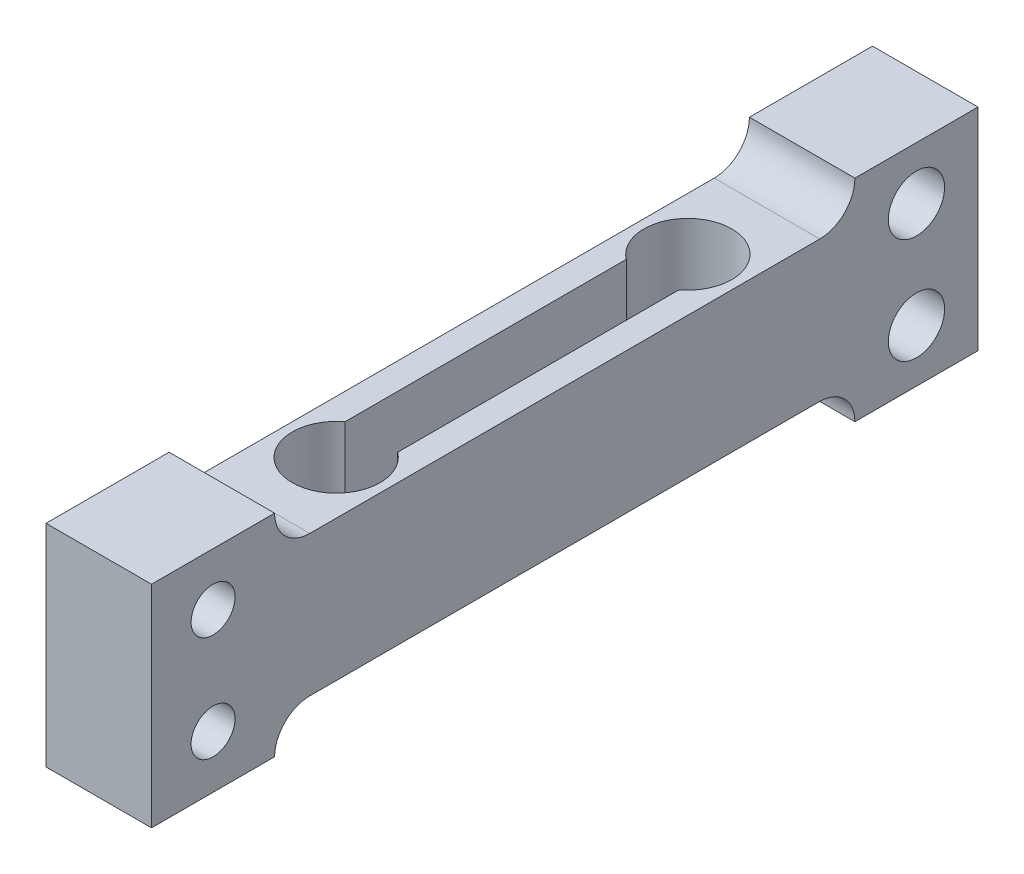
ISO-10303-21;
HEADER;
FILE_DESCRIPTION(('STEP AP214'),'2;1');
FILE_NAME('part.step','',(''),(''),'','','');
FILE_SCHEMA(('AUTOMOTIVE_DESIGN { 1 0 10303 214 1 1 1 1 }'));
ENDSEC;
DATA;
#1=APPLICATION_CONTEXT('core data for automotive mechanical design processes');
#2=APPLICATION_PROTOCOL_DEFINITION('international standard','automotive_design',2000,#1);
#3=PRODUCT_CONTEXT('',#1,'mechanical');
#4=PRODUCT('Part','Part','',(#3));
#5=PRODUCT_RELATED_PRODUCT_CATEGORY('part','',(#4));
#6=PRODUCT_DEFINITION_FORMATION('','',#4);
#7=PRODUCT_DEFINITION_CONTEXT('part definition',#1,'design');
#8=PRODUCT_DEFINITION('design','',#6,#7);
#9=PRODUCT_DEFINITION_SHAPE('','',#8);
#10=(LENGTH_UNIT() NAMED_UNIT(*) SI_UNIT(.MILLI.,.METRE.));
#11=(NAMED_UNIT(*) PLANE_ANGLE_UNIT() SI_UNIT($,.RADIAN.));
#12=(NAMED_UNIT(*) SI_UNIT($,.STERADIAN.) SOLID_ANGLE_UNIT());
#13=UNCERTAINTY_MEASURE_WITH_UNIT(LENGTH_MEASURE(1.E-05),#10,'distance_accuracy_value','');
#14=(GEOMETRIC_REPRESENTATION_CONTEXT(3) GLOBAL_UNCERTAINTY_ASSIGNED_CONTEXT((#13)) GLOBAL_UNIT_ASSIGNED_CONTEXT((#10,
#11,#12)) REPRESENTATION_CONTEXT('',''));
#15=CARTESIAN_POINT('',(0.,0.,0.));
#16=DIRECTION('',(0.,0.,1.));
#17=DIRECTION('',(1.,0.,0.));
#18=AXIS2_PLACEMENT_3D('',#15,#16,#17);
#19=CARTESIAN_POINT('',(6.,6.,23.5));
#20=DIRECTION('',(0.,-1.,0.));
#21=DIRECTION('',(0.,0.,-1.));
#22=AXIS2_PLACEMENT_3D('',#19,#20,#21);
#23=PLANE('',#22);
#24=DIRECTION('',(0.,0.,1.));
#25=VECTOR('',#24,1.);
#26=CARTESIAN_POINT('',(6.,6.,23.5));
#27=LINE('',#26,#25);
#28=CARTESIAN_POINT('',(6.,6.,16.5));
#29=VERTEX_POINT('',#28);
#30=CARTESIAN_POINT('',(6.,6.,23.5));
#31=VERTEX_POINT('',#30);
#32=EDGE_CURVE('E264',#29,#31,#27,.T.);
#33=ORIENTED_EDGE('',*,*,#32,.F.);
#34=DIRECTION('',(1.,0.,0.));
#35=VECTOR('',#34,1.);
#36=CARTESIAN_POINT('',(0.,6.,16.5));
#37=LINE('',#36,#35);
#38=CARTESIAN_POINT('',(0.,6.,16.5));
#39=VERTEX_POINT('',#38);
#40=EDGE_CURVE('E228',#39,#29,#37,.T.);
#41=ORIENTED_EDGE('',*,*,#40,.F.);
#42=DIRECTION('',(0.,0.,1.));
#43=VECTOR('',#42,1.);
#44=CARTESIAN_POINT('',(0.,6.,23.5));
#45=LINE('',#44,#43);
#46=CARTESIAN_POINT('',(0.,6.,23.5));
#47=VERTEX_POINT('',#46);
#48=EDGE_CURVE('E278',#39,#47,#45,.T.);
#49=ORIENTED_EDGE('',*,*,#48,.T.);
#50=DIRECTION('',(-1.,0.,0.));
#51=VECTOR('',#50,1.);
#52=CARTESIAN_POINT('',(6.,6.,23.5));
#53=LINE('',#52,#51);
#54=EDGE_CURVE('E292',#31,#47,#53,.T.);
#55=ORIENTED_EDGE('',*,*,#54,.F.);
#56=EDGE_LOOP('',(#33,#41,#49,#55));
#57=FACE_BOUND('',#56,.T.);
#58=ADVANCED_FACE('F45',(#57),#23,.F.);
#59=CARTESIAN_POINT('',(6.,-6.,23.5));
#60=DIRECTION('',(0.,1.,0.));
#61=DIRECTION('',(0.,0.,1.));
#62=AXIS2_PLACEMENT_3D('',#59,#60,#61);
#63=PLANE('',#62);
#64=DIRECTION('',(0.,0.,-1.));
#65=VECTOR('',#64,1.);
#66=CARTESIAN_POINT('',(6.,-6.,23.5));
#67=LINE('',#66,#65);
#68=CARTESIAN_POINT('',(6.,-6.,-16.5));
#69=VERTEX_POINT('',#68);
#70=CARTESIAN_POINT('',(6.,-6.,-23.5));
#71=VERTEX_POINT('',#70);
#72=EDGE_CURVE('E271',#69,#71,#67,.T.);
#73=ORIENTED_EDGE('',*,*,#72,.F.);
#74=DIRECTION('',(1.,0.,0.));
#75=VECTOR('',#74,1.);
#76=CARTESIAN_POINT('',(0.,-6.,-16.5));
#77=LINE('',#76,#75);
#78=CARTESIAN_POINT('',(0.,-6.,-16.5));
#79=VERTEX_POINT('',#78);
#80=EDGE_CURVE('E224',#79,#69,#77,.T.);
#81=ORIENTED_EDGE('',*,*,#80,.F.);
#82=DIRECTION('',(0.,0.,-1.));
#83=VECTOR('',#82,1.);
#84=CARTESIAN_POINT('',(0.,-6.,23.5));
#85=LINE('',#84,#83);
#86=CARTESIAN_POINT('',(0.,-6.,-23.5));
#87=VERTEX_POINT('',#86);
#88=EDGE_CURVE('E284',#79,#87,#85,.T.);
#89=ORIENTED_EDGE('',*,*,#88,.T.);
#90=DIRECTION('',(-1.,0.,0.));
#91=VECTOR('',#90,1.);
#92=CARTESIAN_POINT('',(6.,-6.,-23.5));
#93=LINE('',#92,#91);
#94=EDGE_CURVE('E275',#71,#87,#93,.T.);
#95=ORIENTED_EDGE('',*,*,#94,.F.);
#96=EDGE_LOOP('',(#73,#81,#89,#95));
#97=FACE_BOUND('',#96,.T.);
#98=ADVANCED_FACE('F324',(#97),#63,.F.);
#99=CARTESIAN_POINT('',(6.,-6.,-23.5));
#100=DIRECTION('',(0.,0.,1.));
#101=DIRECTION('',(1.,0.,0.));
#102=AXIS2_PLACEMENT_3D('',#99,#100,#101);
#103=PLANE('',#102);
#104=DIRECTION('',(0.,1.,0.));
#105=VECTOR('',#104,1.);
#106=CARTESIAN_POINT('',(0.,-6.,-23.5));
#107=LINE('',#106,#105);
#108=CARTESIAN_POINT('',(0.,6.,-23.5));
#109=VERTEX_POINT('',#108);
#110=EDGE_CURVE('E230',#87,#109,#107,.T.);
#111=ORIENTED_EDGE('',*,*,#110,.T.);
#112=DIRECTION('',(-1.,0.,0.));
#113=VECTOR('',#112,1.);
#114=CARTESIAN_POINT('',(6.,6.,-23.5));
#115=LINE('',#114,#113);
#116=CARTESIAN_POINT('',(6.,6.,-23.5));
#117=VERTEX_POINT('',#116);
#118=EDGE_CURVE('E295',#117,#109,#115,.T.);
#119=ORIENTED_EDGE('',*,*,#118,.F.);
#120=DIRECTION('',(0.,1.,0.));
#121=VECTOR('',#120,1.);
#122=CARTESIAN_POINT('',(6.,-6.,-23.5));
#123=LINE('',#122,#121);
#124=EDGE_CURVE('E261',#71,#117,#123,.T.);
#125=ORIENTED_EDGE('',*,*,#124,.F.);
#126=ORIENTED_EDGE('',*,*,#94,.T.);
#127=EDGE_LOOP('',(#111,#119,#125,#126));
#128=FACE_BOUND('',#127,.T.);
#129=ADVANCED_FACE('F47',(#128),#103,.F.);
#130=CARTESIAN_POINT('',(0.,6.,-16.5));
#131=VERTEX_POINT('',#130);
#132=EDGE_CURVE('E279',#109,#131,#45,.T.);
#133=ORIENTED_EDGE('',*,*,#132,.T.);
#134=DIRECTION('',(1.,0.,0.));
#135=VECTOR('',#134,1.);
#136=CARTESIAN_POINT('',(0.,6.,-16.5));
#137=LINE('',#136,#135);
#138=CARTESIAN_POINT('',(6.,6.,-16.5));
#139=VERTEX_POINT('',#138);
#140=EDGE_CURVE('E231',#131,#139,#137,.T.);
#141=ORIENTED_EDGE('',*,*,#140,.T.);
#142=EDGE_CURVE('E266',#117,#139,#27,.T.);
#143=ORIENTED_EDGE('',*,*,#142,.F.);
#144=ORIENTED_EDGE('',*,*,#118,.T.);
#145=EDGE_LOOP('',(#133,#141,#143,#144));
#146=FACE_BOUND('',#145,.T.);
#147=ADVANCED_FACE('F326',(#146),#23,.F.);
#148=CARTESIAN_POINT('',(6.,-6.,23.5));
#149=DIRECTION('',(0.,0.,-1.));
#150=DIRECTION('',(-1.,0.,0.));
#151=AXIS2_PLACEMENT_3D('',#148,#149,#150);
#152=PLANE('',#151);
#153=DIRECTION('',(0.,-1.,0.));
#154=VECTOR('',#153,1.);
#155=CARTESIAN_POINT('',(0.,-6.,23.5));
#156=LINE('',#155,#154);
#157=CARTESIAN_POINT('',(0.,-6.,23.5));
#158=VERTEX_POINT('',#157);
#159=EDGE_CURVE('E282',#47,#158,#156,.T.);
#160=ORIENTED_EDGE('',*,*,#159,.T.);
#161=DIRECTION('',(-1.,0.,0.));
#162=VECTOR('',#161,1.);
#163=CARTESIAN_POINT('',(6.,-6.,23.5));
#164=LINE('',#163,#162);
#165=CARTESIAN_POINT('',(6.,-6.,23.5));
#166=VERTEX_POINT('',#165);
#167=EDGE_CURVE('E289',#166,#158,#164,.T.);
#168=ORIENTED_EDGE('',*,*,#167,.F.);
#169=DIRECTION('',(0.,-1.,0.));
#170=VECTOR('',#169,1.);
#171=CARTESIAN_POINT('',(6.,-6.,23.5));
#172=LINE('',#171,#170);
#173=EDGE_CURVE('E269',#31,#166,#172,.T.);
#174=ORIENTED_EDGE('',*,*,#173,.F.);
#175=ORIENTED_EDGE('',*,*,#54,.T.);
#176=EDGE_LOOP('',(#160,#168,#174,#175));
#177=FACE_BOUND('',#176,.T.);
#178=ADVANCED_FACE('F337',(#177),#152,.F.);
#179=CARTESIAN_POINT('',(0.,-6.,16.5));
#180=VERTEX_POINT('',#179);
#181=EDGE_CURVE('E265',#158,#180,#85,.T.);
#182=ORIENTED_EDGE('',*,*,#181,.T.);
#183=DIRECTION('',(1.,0.,0.));
#184=VECTOR('',#183,1.);
#185=CARTESIAN_POINT('',(0.,-6.,16.5));
#186=LINE('',#185,#184);
#187=CARTESIAN_POINT('',(6.,-6.,16.5));
#188=VERTEX_POINT('',#187);
#189=EDGE_CURVE('E255',#180,#188,#186,.T.);
#190=ORIENTED_EDGE('',*,*,#189,.T.);
#191=EDGE_CURVE('E272',#166,#188,#67,.T.);
#192=ORIENTED_EDGE('',*,*,#191,.F.);
#193=ORIENTED_EDGE('',*,*,#167,.T.);
#194=EDGE_LOOP('',(#182,#190,#192,#193));
#195=FACE_BOUND('',#194,.T.);
#196=ADVANCED_FACE('F333',(#195),#63,.F.);
#197=CARTESIAN_POINT('',(6.,0.,0.));
#198=DIRECTION('',(-1.,0.,0.));
#199=DIRECTION('',(0.,0.,1.));
#200=AXIS2_PLACEMENT_3D('',#197,#198,#199);
#201=PLANE('',#200);
#202=CARTESIAN_POINT('',(6.,3.,20.));
#203=DIRECTION('',(1.,0.,0.));
#204=DIRECTION('',(0.,0.,-1.));
#205=AXIS2_PLACEMENT_3D('',#202,#203,#204);
#206=CIRCLE('',#205,1.25);
#207=CARTESIAN_POINT('',(6.,3.,18.75));
#208=VERTEX_POINT('',#207);
#209=EDGE_CURVE('E184',#208,#208,#206,.T.);
#210=ORIENTED_EDGE('',*,*,#209,.F.);
#211=EDGE_LOOP('',(#210));
#212=FACE_BOUND('',#211,.T.);
#213=CARTESIAN_POINT('',(6.,-3.,20.));
#214=DIRECTION('',(1.,0.,0.));
#215=DIRECTION('',(0.,0.,-1.));
#216=AXIS2_PLACEMENT_3D('',#213,#214,#215);
#217=CIRCLE('',#216,1.25);
#218=CARTESIAN_POINT('',(6.,-3.,18.75));
#219=VERTEX_POINT('',#218);
#220=EDGE_CURVE('E192',#219,#219,#217,.T.);
#221=ORIENTED_EDGE('',*,*,#220,.F.);
#222=EDGE_LOOP('',(#221));
#223=FACE_BOUND('',#222,.T.);
#224=CARTESIAN_POINT('',(6.,3.,-20.));
#225=DIRECTION('',(1.,0.,0.));
#226=DIRECTION('',(0.,0.,-1.));
#227=AXIS2_PLACEMENT_3D('',#224,#225,#226);
#228=CIRCLE('',#227,1.6);
#229=CARTESIAN_POINT('',(6.,3.,-21.6));
#230=VERTEX_POINT('',#229);
#231=EDGE_CURVE('E200',#230,#230,#228,.T.);
#232=ORIENTED_EDGE('',*,*,#231,.F.);
#233=EDGE_LOOP('',(#232));
#234=FACE_BOUND('',#233,.T.);
#235=CARTESIAN_POINT('',(6.,-3.,-20.));
#236=DIRECTION('',(1.,0.,0.));
#237=DIRECTION('',(0.,0.,-1.));
#238=AXIS2_PLACEMENT_3D('',#235,#236,#237);
#239=CIRCLE('',#238,1.6);
#240=CARTESIAN_POINT('',(6.,-3.,-21.6));
#241=VERTEX_POINT('',#240);
#242=EDGE_CURVE('E206',#241,#241,#239,.T.);
#243=ORIENTED_EDGE('',*,*,#242,.F.);
#244=EDGE_LOOP('',(#243));
#245=FACE_BOUND('',#244,.T.);
#246=DIRECTION('',(0.,0.,-1.));
#247=VECTOR('',#246,1.);
#248=CARTESIAN_POINT('',(6.,4.,14.5));
#249=LINE('',#248,#247);
#250=CARTESIAN_POINT('',(6.,4.,14.5));
#251=VERTEX_POINT('',#250);
#252=CARTESIAN_POINT('',(6.,4.,-14.5));
#253=VERTEX_POINT('',#252);
#254=EDGE_CURVE('E223',#251,#253,#249,.T.);
#255=ORIENTED_EDGE('',*,*,#254,.F.);
#256=CARTESIAN_POINT('',(6.,6.,14.5));
#257=DIRECTION('',(1.,0.,0.));
#258=DIRECTION('',(0.,0.,-1.));
#259=AXIS2_PLACEMENT_3D('',#256,#257,#258);
#260=CIRCLE('',#259,2.);
#261=EDGE_CURVE('E220',#29,#251,#260,.T.);
#262=ORIENTED_EDGE('',*,*,#261,.F.);
#263=ORIENTED_EDGE('',*,*,#32,.T.);
#264=ORIENTED_EDGE('',*,*,#173,.T.);
#265=ORIENTED_EDGE('',*,*,#191,.T.);
#266=CARTESIAN_POINT('',(6.,-6.,14.5));
#267=DIRECTION('',(1.,0.,0.));
#268=DIRECTION('',(0.,0.,1.));
#269=AXIS2_PLACEMENT_3D('',#266,#267,#268);
#270=CIRCLE('',#269,2.);
#271=CARTESIAN_POINT('',(6.,-4.,14.5));
#272=VERTEX_POINT('',#271);
#273=EDGE_CURVE('E241',#272,#188,#270,.T.);
#274=ORIENTED_EDGE('',*,*,#273,.F.);
#275=DIRECTION('',(0.,0.,1.));
#276=VECTOR('',#275,1.);
#277=CARTESIAN_POINT('',(6.,-4.,14.5));
#278=LINE('',#277,#276);
#279=CARTESIAN_POINT('',(6.,-4.,-14.5));
#280=VERTEX_POINT('',#279);
#281=EDGE_CURVE('E250',#280,#272,#278,.T.);
#282=ORIENTED_EDGE('',*,*,#281,.F.);
#283=CARTESIAN_POINT('',(6.,-6.,-14.5));
#284=DIRECTION('',(1.,0.,0.));
#285=DIRECTION('',(0.,0.,-1.));
#286=AXIS2_PLACEMENT_3D('',#283,#284,#285);
#287=CIRCLE('',#286,2.);
#288=EDGE_CURVE('E199',#69,#280,#287,.T.);
#289=ORIENTED_EDGE('',*,*,#288,.F.);
#290=ORIENTED_EDGE('',*,*,#72,.T.);
#291=ORIENTED_EDGE('',*,*,#124,.T.);
#292=ORIENTED_EDGE('',*,*,#142,.T.);
#293=CARTESIAN_POINT('',(6.,6.,-14.5));
#294=DIRECTION('',(1.,0.,0.));
#295=DIRECTION('',(0.,0.,1.));
#296=AXIS2_PLACEMENT_3D('',#293,#294,#295);
#297=CIRCLE('',#296,2.);
#298=EDGE_CURVE('E213',#253,#139,#297,.T.);
#299=ORIENTED_EDGE('',*,*,#298,.F.);
#300=EDGE_LOOP('',(#255,#262,#263,#264,#265,#274,#282,#289,#290,#291,#292,#299));
#301=FACE_BOUND('',#300,.T.);
#302=ADVANCED_FACE('F358',(#212,#223,#234,#245,#301),#201,.F.);
#303=CARTESIAN_POINT('',(0.,0.,0.));
#304=DIRECTION('',(-1.,0.,0.));
#305=DIRECTION('',(0.,0.,1.));
#306=AXIS2_PLACEMENT_3D('',#303,#304,#305);
#307=PLANE('',#306);
#308=CARTESIAN_POINT('',(0.,3.,20.));
#309=DIRECTION('',(-1.,0.,0.));
#310=DIRECTION('',(0.,0.,1.));
#311=AXIS2_PLACEMENT_3D('',#308,#309,#310);
#312=CIRCLE('',#311,1.25);
#313=CARTESIAN_POINT('',(0.,3.,21.25));
#314=VERTEX_POINT('',#313);
#315=EDGE_CURVE('E189',#314,#314,#312,.T.);
#316=ORIENTED_EDGE('',*,*,#315,.F.);
#317=EDGE_LOOP('',(#316));
#318=FACE_BOUND('',#317,.T.);
#319=CARTESIAN_POINT('',(0.,-3.,20.));
#320=DIRECTION('',(-1.,0.,0.));
#321=DIRECTION('',(0.,0.,1.));
#322=AXIS2_PLACEMENT_3D('',#319,#320,#321);
#323=CIRCLE('',#322,1.25);
#324=CARTESIAN_POINT('',(0.,-3.,21.25));
#325=VERTEX_POINT('',#324);
#326=EDGE_CURVE('E195',#325,#325,#323,.T.);
#327=ORIENTED_EDGE('',*,*,#326,.F.);
#328=EDGE_LOOP('',(#327));
#329=FACE_BOUND('',#328,.T.);
#330=CARTESIAN_POINT('',(0.,3.,-20.));
#331=DIRECTION('',(1.,0.,0.));
#332=DIRECTION('',(0.,0.,-1.));
#333=AXIS2_PLACEMENT_3D('',#330,#331,#332);
#334=CIRCLE('',#333,1.6);
#335=CARTESIAN_POINT('',(0.,3.,-21.6));
#336=VERTEX_POINT('',#335);
#337=EDGE_CURVE('E196',#336,#336,#334,.T.);
#338=ORIENTED_EDGE('',*,*,#337,.T.);
#339=EDGE_LOOP('',(#338));
#340=FACE_BOUND('',#339,.T.);
#341=CARTESIAN_POINT('',(0.,-3.,-20.));
#342=DIRECTION('',(1.,0.,0.));
#343=DIRECTION('',(0.,0.,-1.));
#344=AXIS2_PLACEMENT_3D('',#341,#342,#343);
#345=CIRCLE('',#344,1.6);
#346=CARTESIAN_POINT('',(0.,-3.,-21.6));
#347=VERTEX_POINT('',#346);
#348=EDGE_CURVE('E203',#347,#347,#345,.T.);
#349=ORIENTED_EDGE('',*,*,#348,.T.);
#350=EDGE_LOOP('',(#349));
#351=FACE_BOUND('',#350,.T.);
#352=CARTESIAN_POINT('',(0.,6.,14.5));
#353=DIRECTION('',(1.,0.,0.));
#354=DIRECTION('',(0.,0.,-1.));
#355=AXIS2_PLACEMENT_3D('',#352,#353,#354);
#356=CIRCLE('',#355,2.);
#357=CARTESIAN_POINT('',(0.,4.,14.5));
#358=VERTEX_POINT('',#357);
#359=EDGE_CURVE('E209',#39,#358,#356,.T.);
#360=ORIENTED_EDGE('',*,*,#359,.T.);
#361=DIRECTION('',(0.,0.,-1.));
#362=VECTOR('',#361,1.);
#363=CARTESIAN_POINT('',(0.,4.,14.5));
#364=LINE('',#363,#362);
#365=CARTESIAN_POINT('',(0.,4.,-14.5));
#366=VERTEX_POINT('',#365);
#367=EDGE_CURVE('E212',#358,#366,#364,.T.);
#368=ORIENTED_EDGE('',*,*,#367,.T.);
#369=CARTESIAN_POINT('',(0.,6.,-14.5));
#370=DIRECTION('',(1.,0.,0.));
#371=DIRECTION('',(0.,0.,1.));
#372=AXIS2_PLACEMENT_3D('',#369,#370,#371);
#373=CIRCLE('',#372,2.);
#374=EDGE_CURVE('E216',#366,#131,#373,.T.);
#375=ORIENTED_EDGE('',*,*,#374,.T.);
#376=ORIENTED_EDGE('',*,*,#132,.F.);
#377=ORIENTED_EDGE('',*,*,#110,.F.);
#378=ORIENTED_EDGE('',*,*,#88,.F.);
#379=CARTESIAN_POINT('',(0.,-6.,-14.5));
#380=DIRECTION('',(1.,0.,0.));
#381=DIRECTION('',(0.,0.,-1.));
#382=AXIS2_PLACEMENT_3D('',#379,#380,#381);
#383=CIRCLE('',#382,2.);
#384=CARTESIAN_POINT('',(0.,-4.,-14.5));
#385=VERTEX_POINT('',#384);
#386=EDGE_CURVE('E237',#79,#385,#383,.T.);
#387=ORIENTED_EDGE('',*,*,#386,.T.);
#388=DIRECTION('',(0.,0.,1.));
#389=VECTOR('',#388,1.);
#390=CARTESIAN_POINT('',(0.,-4.,14.5));
#391=LINE('',#390,#389);
#392=CARTESIAN_POINT('',(0.,-4.,14.5));
#393=VERTEX_POINT('',#392);
#394=EDGE_CURVE('E240',#385,#393,#391,.T.);
#395=ORIENTED_EDGE('',*,*,#394,.T.);
#396=CARTESIAN_POINT('',(0.,-6.,14.5));
#397=DIRECTION('',(1.,0.,0.));
#398=DIRECTION('',(0.,0.,1.));
#399=AXIS2_PLACEMENT_3D('',#396,#397,#398);
#400=CIRCLE('',#399,2.);
#401=EDGE_CURVE('E244',#393,#180,#400,.T.);
#402=ORIENTED_EDGE('',*,*,#401,.T.);
#403=ORIENTED_EDGE('',*,*,#181,.F.);
#404=ORIENTED_EDGE('',*,*,#159,.F.);
#405=ORIENTED_EDGE('',*,*,#48,.F.);
#406=EDGE_LOOP('',(#360,#368,#375,#376,#377,#378,#387,#395,#402,#403,#404,#405));
#407=FACE_BOUND('',#406,.T.);
#408=ADVANCED_FACE('F348',(#318,#329,#340,#351,#407),#307,.T.);
#409=CARTESIAN_POINT('',(0.,-6.,-14.5));
#410=DIRECTION('',(1.,0.,0.));
#411=DIRECTION('',(0.,0.,-1.));
#412=AXIS2_PLACEMENT_3D('',#409,#410,#411);
#413=CYLINDRICAL_SURFACE('',#412,2.);
#414=ORIENTED_EDGE('',*,*,#288,.T.);
#415=DIRECTION('',(1.,0.,0.));
#416=VECTOR('',#415,1.);
#417=CARTESIAN_POINT('',(0.,-4.,-14.5));
#418=LINE('',#417,#416);
#419=EDGE_CURVE('E247',#385,#280,#418,.T.);
#420=ORIENTED_EDGE('',*,*,#419,.F.);
#421=ORIENTED_EDGE('',*,*,#386,.F.);
#422=ORIENTED_EDGE('',*,*,#80,.T.);
#423=EDGE_LOOP('',(#414,#420,#421,#422));
#424=FACE_BOUND('',#423,.T.);
#425=ADVANCED_FACE('F366',(#424),#413,.F.);
#426=CARTESIAN_POINT('',(0.,-6.,14.5));
#427=DIRECTION('',(1.,0.,0.));
#428=DIRECTION('',(0.,0.,-1.));
#429=AXIS2_PLACEMENT_3D('',#426,#427,#428);
#430=CYLINDRICAL_SURFACE('',#429,2.);
#431=ORIENTED_EDGE('',*,*,#273,.T.);
#432=ORIENTED_EDGE('',*,*,#189,.F.);
#433=ORIENTED_EDGE('',*,*,#401,.F.);
#434=DIRECTION('',(1.,0.,0.));
#435=VECTOR('',#434,1.);
#436=CARTESIAN_POINT('',(0.,-4.,14.5));
#437=LINE('',#436,#435);
#438=EDGE_CURVE('E258',#393,#272,#437,.T.);
#439=ORIENTED_EDGE('',*,*,#438,.T.);
#440=EDGE_LOOP('',(#431,#432,#433,#439));
#441=FACE_BOUND('',#440,.T.);
#442=ADVANCED_FACE('F371',(#441),#430,.F.);
#443=CARTESIAN_POINT('',(0.,-4.,14.5));
#444=DIRECTION('',(0.,1.,0.));
#445=DIRECTION('',(0.,0.,1.));
#446=AXIS2_PLACEMENT_3D('',#443,#444,#445);
#447=PLANE('',#446);
#448=DIRECTION('',(0.,0.,-1.));
#449=VECTOR('',#448,1.);
#450=CARTESIAN_POINT('',(1.5,-4.,-8.));
#451=LINE('',#450,#449);
#452=CARTESIAN_POINT('',(1.5,-4.,8.));
#453=VERTEX_POINT('',#452);
#454=CARTESIAN_POINT('',(1.5,-4.,-8.));
#455=VERTEX_POINT('',#454);
#456=EDGE_CURVE('E170',#453,#455,#451,.T.);
#457=ORIENTED_EDGE('',*,*,#456,.F.);
#458=CARTESIAN_POINT('',(3.,-4.,10.));
#459=DIRECTION('',(0.,-1.,0.));
#460=DIRECTION('',(0.,0.,-1.));
#461=AXIS2_PLACEMENT_3D('',#458,#459,#460);
#462=CIRCLE('',#461,2.5);
#463=CARTESIAN_POINT('',(4.5,-4.,8.));
#464=VERTEX_POINT('',#463);
#465=EDGE_CURVE('E60',#464,#453,#462,.T.);
#466=ORIENTED_EDGE('',*,*,#465,.F.);
#467=DIRECTION('',(0.,0.,1.));
#468=VECTOR('',#467,1.);
#469=CARTESIAN_POINT('',(4.5,-4.,8.));
#470=LINE('',#469,#468);
#471=CARTESIAN_POINT('',(4.5,-4.,-8.));
#472=VERTEX_POINT('',#471);
#473=EDGE_CURVE('E177',#472,#464,#470,.T.);
#474=ORIENTED_EDGE('',*,*,#473,.F.);
#475=CARTESIAN_POINT('',(3.,-4.,-10.));
#476=DIRECTION('',(0.,-1.,0.));
#477=DIRECTION('',(0.,0.,-1.));
#478=AXIS2_PLACEMENT_3D('',#475,#476,#477);
#479=CIRCLE('',#478,2.5);
#480=EDGE_CURVE('E161',#455,#472,#479,.T.);
#481=ORIENTED_EDGE('',*,*,#480,.F.);
#482=EDGE_LOOP('',(#457,#466,#474,#481));
#483=FACE_BOUND('',#482,.T.);
#484=ORIENTED_EDGE('',*,*,#281,.T.);
#485=ORIENTED_EDGE('',*,*,#438,.F.);
#486=ORIENTED_EDGE('',*,*,#394,.F.);
#487=ORIENTED_EDGE('',*,*,#419,.T.);
#488=EDGE_LOOP('',(#484,#485,#486,#487));
#489=FACE_BOUND('',#488,.T.);
#490=ADVANCED_FACE('F174',(#483,#489),#447,.F.);
#491=CARTESIAN_POINT('',(0.,6.,14.5));
#492=DIRECTION('',(1.,0.,0.));
#493=DIRECTION('',(0.,0.,-1.));
#494=AXIS2_PLACEMENT_3D('',#491,#492,#493);
#495=CYLINDRICAL_SURFACE('',#494,2.);
#496=ORIENTED_EDGE('',*,*,#261,.T.);
#497=DIRECTION('',(1.,0.,0.));
#498=VECTOR('',#497,1.);
#499=CARTESIAN_POINT('',(0.,4.,14.5));
#500=LINE('',#499,#498);
#501=EDGE_CURVE('E219',#358,#251,#500,.T.);
#502=ORIENTED_EDGE('',*,*,#501,.F.);
#503=ORIENTED_EDGE('',*,*,#359,.F.);
#504=ORIENTED_EDGE('',*,*,#40,.T.);
#505=EDGE_LOOP('',(#496,#502,#503,#504));
#506=FACE_BOUND('',#505,.T.);
#507=ADVANCED_FACE('F382',(#506),#495,.F.);
#508=CARTESIAN_POINT('',(0.,6.,-14.5));
#509=DIRECTION('',(1.,0.,0.));
#510=DIRECTION('',(0.,0.,-1.));
#511=AXIS2_PLACEMENT_3D('',#508,#509,#510);
#512=CYLINDRICAL_SURFACE('',#511,2.);
#513=ORIENTED_EDGE('',*,*,#298,.T.);
#514=ORIENTED_EDGE('',*,*,#140,.F.);
#515=ORIENTED_EDGE('',*,*,#374,.F.);
#516=DIRECTION('',(1.,0.,0.));
#517=VECTOR('',#516,1.);
#518=CARTESIAN_POINT('',(0.,4.,-14.5));
#519=LINE('',#518,#517);
#520=EDGE_CURVE('E234',#366,#253,#519,.T.);
#521=ORIENTED_EDGE('',*,*,#520,.T.);
#522=EDGE_LOOP('',(#513,#514,#515,#521));
#523=FACE_BOUND('',#522,.T.);
#524=ADVANCED_FACE('F353',(#523),#512,.F.);
#525=CARTESIAN_POINT('',(0.,4.,14.5));
#526=DIRECTION('',(0.,-1.,0.));
#527=DIRECTION('',(0.,0.,-1.));
#528=AXIS2_PLACEMENT_3D('',#525,#526,#527);
#529=PLANE('',#528);
#530=DIRECTION('',(0.,0.,1.));
#531=VECTOR('',#530,1.);
#532=CARTESIAN_POINT('',(4.5,4.,14.5));
#533=LINE('',#532,#531);
#534=CARTESIAN_POINT('',(4.5,4.,-8.));
#535=VERTEX_POINT('',#534);
#536=CARTESIAN_POINT('',(4.5,4.,8.));
#537=VERTEX_POINT('',#536);
#538=EDGE_CURVE('E53',#535,#537,#533,.T.);
#539=ORIENTED_EDGE('',*,*,#538,.T.);
#540=CARTESIAN_POINT('',(3.,4.,10.));
#541=DIRECTION('',(0.,-1.,0.));
#542=DIRECTION('',(0.,0.,-1.));
#543=AXIS2_PLACEMENT_3D('',#540,#541,#542);
#544=CIRCLE('',#543,2.5);
#545=CARTESIAN_POINT('',(1.5,4.,8.));
#546=VERTEX_POINT('',#545);
#547=EDGE_CURVE('E11',#537,#546,#544,.T.);
#548=ORIENTED_EDGE('',*,*,#547,.T.);
#549=DIRECTION('',(0.,0.,-1.));
#550=VECTOR('',#549,1.);
#551=CARTESIAN_POINT('',(1.5,4.,14.5));
#552=LINE('',#551,#550);
#553=CARTESIAN_POINT('',(1.5,4.,-8.));
#554=VERTEX_POINT('',#553);
#555=EDGE_CURVE('E298',#546,#554,#552,.T.);
#556=ORIENTED_EDGE('',*,*,#555,.T.);
#557=CARTESIAN_POINT('',(3.,4.,-10.));
#558=DIRECTION('',(0.,-1.,0.));
#559=DIRECTION('',(0.,0.,-1.));
#560=AXIS2_PLACEMENT_3D('',#557,#558,#559);
#561=CIRCLE('',#560,2.5);
#562=EDGE_CURVE('E164',#554,#535,#561,.T.);
#563=ORIENTED_EDGE('',*,*,#562,.T.);
#564=EDGE_LOOP('',(#539,#548,#556,#563));
#565=FACE_BOUND('',#564,.T.);
#566=ORIENTED_EDGE('',*,*,#254,.T.);
#567=ORIENTED_EDGE('',*,*,#520,.F.);
#568=ORIENTED_EDGE('',*,*,#367,.F.);
#569=ORIENTED_EDGE('',*,*,#501,.T.);
#570=EDGE_LOOP('',(#566,#567,#568,#569));
#571=FACE_BOUND('',#570,.T.);
#572=ADVANCED_FACE('F304',(#565,#571),#529,.F.);
#573=CARTESIAN_POINT('',(0.,-3.,-20.));
#574=DIRECTION('',(1.,0.,0.));
#575=DIRECTION('',(0.,0.,-1.));
#576=AXIS2_PLACEMENT_3D('',#573,#574,#575);
#577=CYLINDRICAL_SURFACE('',#576,1.6);
#578=ORIENTED_EDGE('',*,*,#348,.F.);
#579=EDGE_LOOP('',(#578));
#580=FACE_BOUND('',#579,.T.);
#581=ORIENTED_EDGE('',*,*,#242,.T.);
#582=EDGE_LOOP('',(#581));
#583=FACE_BOUND('',#582,.T.);
#584=ADVANCED_FACE('F432',(#580,#583),#577,.F.);
#585=CARTESIAN_POINT('',(0.,3.,-20.));
#586=DIRECTION('',(1.,0.,0.));
#587=DIRECTION('',(0.,0.,-1.));
#588=AXIS2_PLACEMENT_3D('',#585,#586,#587);
#589=CYLINDRICAL_SURFACE('',#588,1.6);
#590=ORIENTED_EDGE('',*,*,#337,.F.);
#591=EDGE_LOOP('',(#590));
#592=FACE_BOUND('',#591,.T.);
#593=ORIENTED_EDGE('',*,*,#231,.T.);
#594=EDGE_LOOP('',(#593));
#595=FACE_BOUND('',#594,.T.);
#596=ADVANCED_FACE('F437',(#592,#595),#589,.F.);
#597=CARTESIAN_POINT('',(6.,-3.,20.));
#598=DIRECTION('',(1.,0.,0.));
#599=DIRECTION('',(0.,0.,-1.));
#600=AXIS2_PLACEMENT_3D('',#597,#598,#599);
#601=CYLINDRICAL_SURFACE('',#600,1.25);
#602=ORIENTED_EDGE('',*,*,#326,.T.);
#603=EDGE_LOOP('',(#602));
#604=FACE_BOUND('',#603,.T.);
#605=ORIENTED_EDGE('',*,*,#220,.T.);
#606=EDGE_LOOP('',(#605));
#607=FACE_BOUND('',#606,.T.);
#608=ADVANCED_FACE('F319',(#604,#607),#601,.F.);
#609=CARTESIAN_POINT('',(6.,3.,20.));
#610=DIRECTION('',(1.,0.,0.));
#611=DIRECTION('',(0.,0.,-1.));
#612=AXIS2_PLACEMENT_3D('',#609,#610,#611);
#613=CYLINDRICAL_SURFACE('',#612,1.25);
#614=ORIENTED_EDGE('',*,*,#315,.T.);
#615=EDGE_LOOP('',(#614));
#616=FACE_BOUND('',#615,.T.);
#617=ORIENTED_EDGE('',*,*,#209,.T.);
#618=EDGE_LOOP('',(#617));
#619=FACE_BOUND('',#618,.T.);
#620=ADVANCED_FACE('F311',(#616,#619),#613,.F.);
#621=CARTESIAN_POINT('',(3.,6.,10.));
#622=DIRECTION('',(0.,-1.,0.));
#623=DIRECTION('',(0.,0.,-1.));
#624=AXIS2_PLACEMENT_3D('',#621,#622,#623);
#625=CYLINDRICAL_SURFACE('',#624,2.5);
#626=DIRECTION('',(0.,-1.,0.));
#627=VECTOR('',#626,1.);
#628=CARTESIAN_POINT('',(4.5,6.,8.));
#629=LINE('',#628,#627);
#630=EDGE_CURVE('E182',#537,#464,#629,.T.);
#631=ORIENTED_EDGE('',*,*,#630,.T.);
#632=ORIENTED_EDGE('',*,*,#465,.T.);
#633=DIRECTION('',(0.,-1.,0.));
#634=VECTOR('',#633,1.);
#635=CARTESIAN_POINT('',(1.5,6.,8.));
#636=LINE('',#635,#634);
#637=EDGE_CURVE('E167',#546,#453,#636,.T.);
#638=ORIENTED_EDGE('',*,*,#637,.F.);
#639=ORIENTED_EDGE('',*,*,#547,.F.);
#640=EDGE_LOOP('',(#631,#632,#638,#639));
#641=FACE_BOUND('',#640,.T.);
#642=ADVANCED_FACE('F309',(#641),#625,.F.);
#643=CARTESIAN_POINT('',(4.5,6.,8.));
#644=DIRECTION('',(1.,0.,0.));
#645=DIRECTION('',(0.,0.,-1.));
#646=AXIS2_PLACEMENT_3D('',#643,#644,#645);
#647=PLANE('',#646);
#648=DIRECTION('',(0.,-1.,0.));
#649=VECTOR('',#648,1.);
#650=CARTESIAN_POINT('',(4.5,6.,-8.));
#651=LINE('',#650,#649);
#652=EDGE_CURVE('E166',#535,#472,#651,.T.);
#653=ORIENTED_EDGE('',*,*,#652,.T.);
#654=ORIENTED_EDGE('',*,*,#473,.T.);
#655=ORIENTED_EDGE('',*,*,#630,.F.);
#656=ORIENTED_EDGE('',*,*,#538,.F.);
#657=EDGE_LOOP('',(#653,#654,#655,#656));
#658=FACE_BOUND('',#657,.T.);
#659=ADVANCED_FACE('F308',(#658),#647,.F.);
#660=CARTESIAN_POINT('',(3.,6.,-10.));
#661=DIRECTION('',(0.,-1.,0.));
#662=DIRECTION('',(0.,0.,-1.));
#663=AXIS2_PLACEMENT_3D('',#660,#661,#662);
#664=CYLINDRICAL_SURFACE('',#663,2.5);
#665=DIRECTION('',(0.,-1.,0.));
#666=VECTOR('',#665,1.);
#667=CARTESIAN_POINT('',(1.5,6.,-8.));
#668=LINE('',#667,#666);
#669=EDGE_CURVE('E68',#554,#455,#668,.T.);
#670=ORIENTED_EDGE('',*,*,#669,.T.);
#671=ORIENTED_EDGE('',*,*,#480,.T.);
#672=ORIENTED_EDGE('',*,*,#652,.F.);
#673=ORIENTED_EDGE('',*,*,#562,.F.);
#674=EDGE_LOOP('',(#670,#671,#672,#673));
#675=FACE_BOUND('',#674,.T.);
#676=ADVANCED_FACE('F158',(#675),#664,.F.);
#677=CARTESIAN_POINT('',(1.5,6.,-8.));
#678=DIRECTION('',(-1.,0.,0.));
#679=DIRECTION('',(0.,0.,1.));
#680=AXIS2_PLACEMENT_3D('',#677,#678,#679);
#681=PLANE('',#680);
#682=ORIENTED_EDGE('',*,*,#637,.T.);
#683=ORIENTED_EDGE('',*,*,#456,.T.);
#684=ORIENTED_EDGE('',*,*,#669,.F.);
#685=ORIENTED_EDGE('',*,*,#555,.F.);
#686=EDGE_LOOP('',(#682,#683,#684,#685));
#687=FACE_BOUND('',#686,.T.);
#688=ADVANCED_FACE('F171',(#687),#681,.F.);
#689=CLOSED_SHELL('',(#58,#98,#129,#147,#178,#196,#302,#408,#425,#442,#490,#507,#524,#572,#584,
#596,#608,#620,#642,#659,#676,#688));
#690=MANIFOLD_SOLID_BREP('B2',#689);
#691=ADVANCED_BREP_SHAPE_REPRESENTATION('',(#18,#690),#14);
#692=SHAPE_DEFINITION_REPRESENTATION(#9,#691);
ENDSEC;
END-ISO-10303-21;
